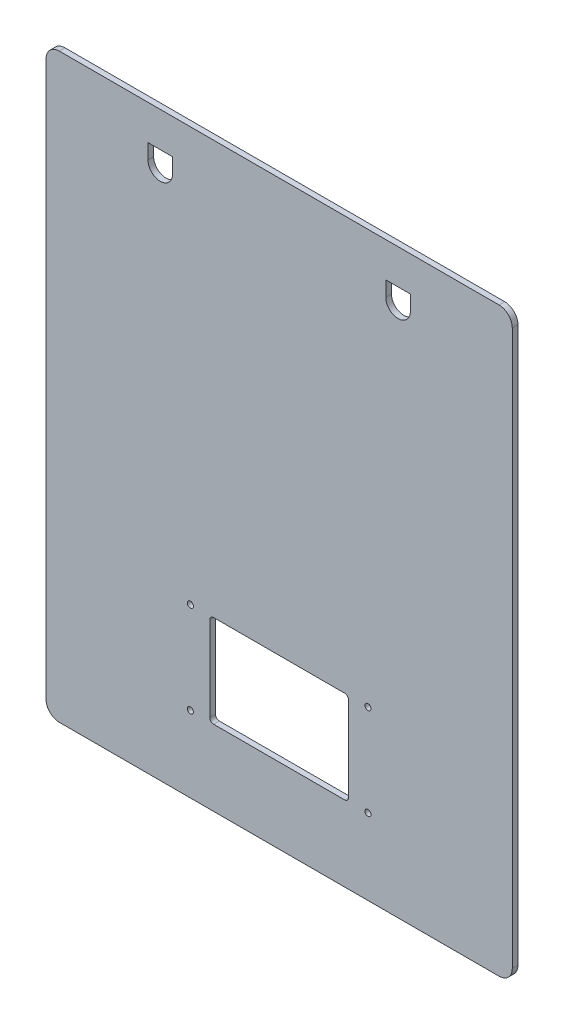
ISO-10303-21;
HEADER;
FILE_DESCRIPTION(('STEP AP214'),'2;1');
FILE_NAME('part.step','',(''),(''),'','','');
FILE_SCHEMA(('AUTOMOTIVE_DESIGN { 1 0 10303 214 1 1 1 1 }'));
ENDSEC;
DATA;
#1=APPLICATION_CONTEXT('core data for automotive mechanical design processes');
#2=APPLICATION_PROTOCOL_DEFINITION('international standard','automotive_design',2000,#1);
#3=PRODUCT_CONTEXT('',#1,'mechanical');
#4=PRODUCT('Part','Part','',(#3));
#5=PRODUCT_RELATED_PRODUCT_CATEGORY('part','',(#4));
#6=PRODUCT_DEFINITION_FORMATION('','',#4);
#7=PRODUCT_DEFINITION_CONTEXT('part definition',#1,'design');
#8=PRODUCT_DEFINITION('design','',#6,#7);
#9=PRODUCT_DEFINITION_SHAPE('','',#8);
#10=(LENGTH_UNIT() NAMED_UNIT(*) SI_UNIT(.MILLI.,.METRE.));
#11=(NAMED_UNIT(*) PLANE_ANGLE_UNIT() SI_UNIT($,.RADIAN.));
#12=(NAMED_UNIT(*) SI_UNIT($,.STERADIAN.) SOLID_ANGLE_UNIT());
#13=UNCERTAINTY_MEASURE_WITH_UNIT(LENGTH_MEASURE(1.E-05),#10,'distance_accuracy_value','');
#14=(GEOMETRIC_REPRESENTATION_CONTEXT(3) GLOBAL_UNCERTAINTY_ASSIGNED_CONTEXT((#13)) GLOBAL_UNIT_ASSIGNED_CONTEXT((#10,
#11,#12)) REPRESENTATION_CONTEXT('',''));
#15=CARTESIAN_POINT('',(0.,0.,0.));
#16=DIRECTION('',(0.,0.,1.));
#17=DIRECTION('',(1.,0.,0.));
#18=AXIS2_PLACEMENT_3D('',#15,#16,#17);
#19=CARTESIAN_POINT('',(7.,7.,3.));
#20=DIRECTION('',(0.,0.,-1.));
#21=DIRECTION('',(-1.,0.,0.));
#22=AXIS2_PLACEMENT_3D('',#19,#20,#21);
#23=CYLINDRICAL_SURFACE('',#22,7.);
#24=CARTESIAN_POINT('',(7.,7.,0.));
#25=DIRECTION('',(0.,0.,1.));
#26=DIRECTION('',(1.,0.,0.));
#27=AXIS2_PLACEMENT_3D('',#24,#25,#26);
#28=CIRCLE('',#27,7.);
#29=CARTESIAN_POINT('',(0.,7.00000000000005,0.));
#30=VERTEX_POINT('',#29);
#31=CARTESIAN_POINT('',(7.00000000000005,0.,0.));
#32=VERTEX_POINT('',#31);
#33=EDGE_CURVE('E323',#30,#32,#28,.T.);
#34=ORIENTED_EDGE('',*,*,#33,.T.);
#35=DIRECTION('',(0.,0.,-1.));
#36=VECTOR('',#35,1.);
#37=CARTESIAN_POINT('',(7.00000000000005,0.,3.));
#38=LINE('',#37,#36);
#39=CARTESIAN_POINT('',(7.00000000000005,0.,3.));
#40=VERTEX_POINT('',#39);
#41=EDGE_CURVE('E11',#40,#32,#38,.T.);
#42=ORIENTED_EDGE('',*,*,#41,.F.);
#43=CARTESIAN_POINT('',(7.,7.,3.));
#44=DIRECTION('',(0.,0.,1.));
#45=DIRECTION('',(1.,0.,0.));
#46=AXIS2_PLACEMENT_3D('',#43,#44,#45);
#47=CIRCLE('',#46,7.);
#48=CARTESIAN_POINT('',(0.,7.00000000000005,3.));
#49=VERTEX_POINT('',#48);
#50=EDGE_CURVE('E330',#49,#40,#47,.T.);
#51=ORIENTED_EDGE('',*,*,#50,.F.);
#52=DIRECTION('',(0.,0.,-1.));
#53=VECTOR('',#52,1.);
#54=CARTESIAN_POINT('',(0.,7.00000000000005,3.));
#55=LINE('',#54,#53);
#56=EDGE_CURVE('E348',#49,#30,#55,.T.);
#57=ORIENTED_EDGE('',*,*,#56,.T.);
#58=EDGE_LOOP('',(#34,#42,#51,#57));
#59=FACE_BOUND('',#58,.T.);
#60=ADVANCED_FACE('F33',(#59),#23,.T.);
#61=CARTESIAN_POINT('',(7.00000000000005,0.,3.));
#62=DIRECTION('',(0.,1.,0.));
#63=DIRECTION('',(0.,0.,1.));
#64=AXIS2_PLACEMENT_3D('',#61,#62,#63);
#65=PLANE('',#64);
#66=DIRECTION('',(1.,0.,0.));
#67=VECTOR('',#66,1.);
#68=CARTESIAN_POINT('',(7.00000000000005,0.,0.));
#69=LINE('',#68,#67);
#70=CARTESIAN_POINT('',(240.,0.,0.));
#71=VERTEX_POINT('',#70);
#72=EDGE_CURVE('E351',#32,#71,#69,.T.);
#73=ORIENTED_EDGE('',*,*,#72,.T.);
#74=DIRECTION('',(0.,0.,-1.));
#75=VECTOR('',#74,1.);
#76=CARTESIAN_POINT('',(240.,0.,3.));
#77=LINE('',#76,#75);
#78=CARTESIAN_POINT('',(240.,0.,3.));
#79=VERTEX_POINT('',#78);
#80=EDGE_CURVE('E40',#79,#71,#77,.T.);
#81=ORIENTED_EDGE('',*,*,#80,.F.);
#82=DIRECTION('',(1.,0.,0.));
#83=VECTOR('',#82,1.);
#84=CARTESIAN_POINT('',(7.00000000000005,0.,3.));
#85=LINE('',#84,#83);
#86=EDGE_CURVE('E333',#40,#79,#85,.T.);
#87=ORIENTED_EDGE('',*,*,#86,.F.);
#88=ORIENTED_EDGE('',*,*,#41,.T.);
#89=EDGE_LOOP('',(#73,#81,#87,#88));
#90=FACE_BOUND('',#89,.T.);
#91=ADVANCED_FACE('F407',(#90),#65,.F.);
#92=CARTESIAN_POINT('',(240.,7.,3.));
#93=DIRECTION('',(0.,0.,-1.));
#94=DIRECTION('',(-1.,0.,0.));
#95=AXIS2_PLACEMENT_3D('',#92,#93,#94);
#96=CYLINDRICAL_SURFACE('',#95,7.);
#97=CARTESIAN_POINT('',(240.,7.,0.));
#98=DIRECTION('',(0.,0.,1.));
#99=DIRECTION('',(1.,0.,0.));
#100=AXIS2_PLACEMENT_3D('',#97,#98,#99);
#101=CIRCLE('',#100,7.);
#102=CARTESIAN_POINT('',(247.,7.00000000000005,0.));
#103=VERTEX_POINT('',#102);
#104=EDGE_CURVE('E353',#71,#103,#101,.T.);
#105=ORIENTED_EDGE('',*,*,#104,.T.);
#106=DIRECTION('',(0.,0.,-1.));
#107=VECTOR('',#106,1.);
#108=CARTESIAN_POINT('',(247.,7.00000000000005,3.));
#109=LINE('',#108,#107);
#110=CARTESIAN_POINT('',(247.,7.00000000000005,3.));
#111=VERTEX_POINT('',#110);
#112=EDGE_CURVE('E378',#111,#103,#109,.T.);
#113=ORIENTED_EDGE('',*,*,#112,.F.);
#114=CARTESIAN_POINT('',(240.,7.,3.));
#115=DIRECTION('',(0.,0.,1.));
#116=DIRECTION('',(1.,0.,0.));
#117=AXIS2_PLACEMENT_3D('',#114,#115,#116);
#118=CIRCLE('',#117,7.);
#119=EDGE_CURVE('E336',#79,#111,#118,.T.);
#120=ORIENTED_EDGE('',*,*,#119,.F.);
#121=ORIENTED_EDGE('',*,*,#80,.T.);
#122=EDGE_LOOP('',(#105,#113,#120,#121));
#123=FACE_BOUND('',#122,.T.);
#124=ADVANCED_FACE('F385',(#123),#96,.T.);
#125=CARTESIAN_POINT('',(247.,7.00000000000005,3.));
#126=DIRECTION('',(-1.,0.,0.));
#127=DIRECTION('',(0.,0.,1.));
#128=AXIS2_PLACEMENT_3D('',#125,#126,#127);
#129=PLANE('',#128);
#130=DIRECTION('',(0.,1.,0.));
#131=VECTOR('',#130,1.);
#132=CARTESIAN_POINT('',(247.,7.00000000000005,0.));
#133=LINE('',#132,#131);
#134=CARTESIAN_POINT('',(247.,301.,0.));
#135=VERTEX_POINT('',#134);
#136=EDGE_CURVE('E355',#103,#135,#133,.T.);
#137=ORIENTED_EDGE('',*,*,#136,.T.);
#138=DIRECTION('',(0.,0.,-1.));
#139=VECTOR('',#138,1.);
#140=CARTESIAN_POINT('',(247.,301.,3.));
#141=LINE('',#140,#139);
#142=CARTESIAN_POINT('',(247.,301.,3.));
#143=VERTEX_POINT('',#142);
#144=EDGE_CURVE('E375',#143,#135,#141,.T.);
#145=ORIENTED_EDGE('',*,*,#144,.F.);
#146=DIRECTION('',(0.,1.,0.));
#147=VECTOR('',#146,1.);
#148=CARTESIAN_POINT('',(247.,7.00000000000005,3.));
#149=LINE('',#148,#147);
#150=EDGE_CURVE('E338',#111,#143,#149,.T.);
#151=ORIENTED_EDGE('',*,*,#150,.F.);
#152=ORIENTED_EDGE('',*,*,#112,.T.);
#153=EDGE_LOOP('',(#137,#145,#151,#152));
#154=FACE_BOUND('',#153,.T.);
#155=ADVANCED_FACE('F396',(#154),#129,.F.);
#156=CARTESIAN_POINT('',(240.,301.,3.));
#157=DIRECTION('',(0.,0.,-1.));
#158=DIRECTION('',(-1.,0.,0.));
#159=AXIS2_PLACEMENT_3D('',#156,#157,#158);
#160=CYLINDRICAL_SURFACE('',#159,7.00000000000001);
#161=CARTESIAN_POINT('',(240.,301.,0.));
#162=DIRECTION('',(0.,0.,1.));
#163=DIRECTION('',(1.,0.,0.));
#164=AXIS2_PLACEMENT_3D('',#161,#162,#163);
#165=CIRCLE('',#164,7.00000000000001);
#166=CARTESIAN_POINT('',(240.,308.,0.));
#167=VERTEX_POINT('',#166);
#168=EDGE_CURVE('E357',#135,#167,#165,.T.);
#169=ORIENTED_EDGE('',*,*,#168,.T.);
#170=DIRECTION('',(0.,0.,-1.));
#171=VECTOR('',#170,1.);
#172=CARTESIAN_POINT('',(240.,308.,3.));
#173=LINE('',#172,#171);
#174=CARTESIAN_POINT('',(240.,308.,3.));
#175=VERTEX_POINT('',#174);
#176=EDGE_CURVE('E372',#175,#167,#173,.T.);
#177=ORIENTED_EDGE('',*,*,#176,.F.);
#178=CARTESIAN_POINT('',(240.,301.,3.));
#179=DIRECTION('',(0.,0.,1.));
#180=DIRECTION('',(1.,0.,0.));
#181=AXIS2_PLACEMENT_3D('',#178,#179,#180);
#182=CIRCLE('',#181,7.00000000000001);
#183=EDGE_CURVE('E340',#143,#175,#182,.T.);
#184=ORIENTED_EDGE('',*,*,#183,.F.);
#185=ORIENTED_EDGE('',*,*,#144,.T.);
#186=EDGE_LOOP('',(#169,#177,#184,#185));
#187=FACE_BOUND('',#186,.T.);
#188=ADVANCED_FACE('F400',(#187),#160,.T.);
#189=CARTESIAN_POINT('',(7.00000000000005,308.,3.));
#190=DIRECTION('',(0.,-1.,0.));
#191=DIRECTION('',(0.,0.,-1.));
#192=AXIS2_PLACEMENT_3D('',#189,#190,#191);
#193=PLANE('',#192);
#194=DIRECTION('',(-1.,0.,0.));
#195=VECTOR('',#194,1.);
#196=CARTESIAN_POINT('',(7.00000000000005,308.,0.));
#197=LINE('',#196,#195);
#198=CARTESIAN_POINT('',(7.00000000000005,308.,0.));
#199=VERTEX_POINT('',#198);
#200=EDGE_CURVE('E359',#167,#199,#197,.T.);
#201=ORIENTED_EDGE('',*,*,#200,.T.);
#202=DIRECTION('',(0.,0.,-1.));
#203=VECTOR('',#202,1.);
#204=CARTESIAN_POINT('',(7.00000000000005,308.,3.));
#205=LINE('',#204,#203);
#206=CARTESIAN_POINT('',(7.00000000000005,308.,3.));
#207=VERTEX_POINT('',#206);
#208=EDGE_CURVE('E369',#207,#199,#205,.T.);
#209=ORIENTED_EDGE('',*,*,#208,.F.);
#210=DIRECTION('',(-1.,0.,0.));
#211=VECTOR('',#210,1.);
#212=CARTESIAN_POINT('',(7.00000000000005,308.,3.));
#213=LINE('',#212,#211);
#214=EDGE_CURVE('E342',#175,#207,#213,.T.);
#215=ORIENTED_EDGE('',*,*,#214,.F.);
#216=ORIENTED_EDGE('',*,*,#176,.T.);
#217=EDGE_LOOP('',(#201,#209,#215,#216));
#218=FACE_BOUND('',#217,.T.);
#219=ADVANCED_FACE('F420',(#218),#193,.F.);
#220=CARTESIAN_POINT('',(7.,301.,3.));
#221=DIRECTION('',(0.,0.,-1.));
#222=DIRECTION('',(-1.,0.,0.));
#223=AXIS2_PLACEMENT_3D('',#220,#221,#222);
#224=CYLINDRICAL_SURFACE('',#223,7.);
#225=CARTESIAN_POINT('',(7.,301.,0.));
#226=DIRECTION('',(0.,0.,1.));
#227=DIRECTION('',(-1.,0.,0.));
#228=AXIS2_PLACEMENT_3D('',#225,#226,#227);
#229=CIRCLE('',#228,7.);
#230=CARTESIAN_POINT('',(0.,301.,0.));
#231=VERTEX_POINT('',#230);
#232=EDGE_CURVE('E361',#199,#231,#229,.T.);
#233=ORIENTED_EDGE('',*,*,#232,.T.);
#234=DIRECTION('',(0.,0.,-1.));
#235=VECTOR('',#234,1.);
#236=CARTESIAN_POINT('',(0.,301.,3.));
#237=LINE('',#236,#235);
#238=CARTESIAN_POINT('',(0.,301.,3.));
#239=VERTEX_POINT('',#238);
#240=EDGE_CURVE('E366',#239,#231,#237,.T.);
#241=ORIENTED_EDGE('',*,*,#240,.F.);
#242=CARTESIAN_POINT('',(7.,301.,3.));
#243=DIRECTION('',(0.,0.,1.));
#244=DIRECTION('',(-1.,0.,0.));
#245=AXIS2_PLACEMENT_3D('',#242,#243,#244);
#246=CIRCLE('',#245,7.);
#247=EDGE_CURVE('E344',#207,#239,#246,.T.);
#248=ORIENTED_EDGE('',*,*,#247,.F.);
#249=ORIENTED_EDGE('',*,*,#208,.T.);
#250=EDGE_LOOP('',(#233,#241,#248,#249));
#251=FACE_BOUND('',#250,.T.);
#252=ADVANCED_FACE('F418',(#251),#224,.T.);
#253=CARTESIAN_POINT('',(0.,7.00000000000005,3.));
#254=DIRECTION('',(1.,0.,0.));
#255=DIRECTION('',(0.,0.,-1.));
#256=AXIS2_PLACEMENT_3D('',#253,#254,#255);
#257=PLANE('',#256);
#258=DIRECTION('',(0.,-1.,0.));
#259=VECTOR('',#258,1.);
#260=CARTESIAN_POINT('',(0.,7.00000000000005,0.));
#261=LINE('',#260,#259);
#262=EDGE_CURVE('E334',#231,#30,#261,.T.);
#263=ORIENTED_EDGE('',*,*,#262,.T.);
#264=ORIENTED_EDGE('',*,*,#56,.F.);
#265=DIRECTION('',(0.,-1.,0.));
#266=VECTOR('',#265,1.);
#267=CARTESIAN_POINT('',(0.,7.00000000000005,3.));
#268=LINE('',#267,#266);
#269=EDGE_CURVE('E346',#239,#49,#268,.T.);
#270=ORIENTED_EDGE('',*,*,#269,.F.);
#271=ORIENTED_EDGE('',*,*,#240,.T.);
#272=EDGE_LOOP('',(#263,#264,#270,#271));
#273=FACE_BOUND('',#272,.T.);
#274=ADVANCED_FACE('F413',(#273),#257,.F.);
#275=CARTESIAN_POINT('',(7.,7.,3.));
#276=DIRECTION('',(0.,0.,1.));
#277=DIRECTION('',(1.,0.,0.));
#278=AXIS2_PLACEMENT_3D('',#275,#276,#277);
#279=PLANE('',#278);
#280=CARTESIAN_POINT('',(76.45,88.75,3.));
#281=DIRECTION('',(0.,0.,-1.));
#282=DIRECTION('',(1.,0.,0.));
#283=AXIS2_PLACEMENT_3D('',#280,#281,#282);
#284=CIRCLE('',#283,1.60000000000002);
#285=CARTESIAN_POINT('',(78.05,88.75,3.));
#286=VERTEX_POINT('',#285);
#287=EDGE_CURVE('E683',#286,#286,#284,.T.);
#288=ORIENTED_EDGE('',*,*,#287,.T.);
#289=EDGE_LOOP('',(#288));
#290=FACE_BOUND('',#289,.T.);
#291=CARTESIAN_POINT('',(170.55,40.21,3.));
#292=DIRECTION('',(0.,0.,-1.));
#293=DIRECTION('',(-1.,0.,0.));
#294=AXIS2_PLACEMENT_3D('',#291,#292,#293);
#295=CIRCLE('',#294,1.60000000000002);
#296=CARTESIAN_POINT('',(168.95,40.21,3.));
#297=VERTEX_POINT('',#296);
#298=EDGE_CURVE('E701',#297,#297,#295,.T.);
#299=ORIENTED_EDGE('',*,*,#298,.T.);
#300=EDGE_LOOP('',(#299));
#301=FACE_BOUND('',#300,.T.);
#302=CARTESIAN_POINT('',(76.45,40.21,3.));
#303=DIRECTION('',(0.,0.,-1.));
#304=DIRECTION('',(1.,0.,0.));
#305=AXIS2_PLACEMENT_3D('',#302,#303,#304);
#306=CIRCLE('',#305,1.60000000000002);
#307=CARTESIAN_POINT('',(78.05,40.21,3.));
#308=VERTEX_POINT('',#307);
#309=EDGE_CURVE('E696',#308,#308,#306,.T.);
#310=ORIENTED_EDGE('',*,*,#309,.T.);
#311=EDGE_LOOP('',(#310));
#312=FACE_BOUND('',#311,.T.);
#313=CARTESIAN_POINT('',(170.55,88.75,3.));
#314=DIRECTION('',(0.,0.,-1.));
#315=DIRECTION('',(-1.,0.,0.));
#316=AXIS2_PLACEMENT_3D('',#313,#314,#315);
#317=CIRCLE('',#316,1.60000000000002);
#318=CARTESIAN_POINT('',(168.95,88.75,3.));
#319=VERTEX_POINT('',#318);
#320=EDGE_CURVE('E236',#319,#319,#317,.T.);
#321=ORIENTED_EDGE('',*,*,#320,.T.);
#322=EDGE_LOOP('',(#321));
#323=FACE_BOUND('',#322,.T.);
#324=CARTESIAN_POINT('',(88.7799999999999,86.96,3.));
#325=DIRECTION('',(0.,0.,-1.));
#326=DIRECTION('',(1.,0.,0.));
#327=AXIS2_PLACEMENT_3D('',#324,#325,#326);
#328=CIRCLE('',#327,1.99999999999999);
#329=CARTESIAN_POINT('',(86.78,86.96,3.));
#330=VERTEX_POINT('',#329);
#331=CARTESIAN_POINT('',(88.7799999999999,88.96,3.));
#332=VERTEX_POINT('',#331);
#333=EDGE_CURVE('E195',#330,#332,#328,.T.);
#334=ORIENTED_EDGE('',*,*,#333,.T.);
#335=DIRECTION('',(1.,0.,0.));
#336=VECTOR('',#335,1.);
#337=CARTESIAN_POINT('',(158.22,88.96,3.));
#338=LINE('',#337,#336);
#339=CARTESIAN_POINT('',(158.22,88.96,3.));
#340=VERTEX_POINT('',#339);
#341=EDGE_CURVE('E204',#332,#340,#338,.T.);
#342=ORIENTED_EDGE('',*,*,#341,.T.);
#343=CARTESIAN_POINT('',(158.22,86.96,3.));
#344=DIRECTION('',(0.,0.,-1.));
#345=DIRECTION('',(-1.,0.,0.));
#346=AXIS2_PLACEMENT_3D('',#343,#344,#345);
#347=CIRCLE('',#346,2.);
#348=CARTESIAN_POINT('',(160.22,86.96,3.));
#349=VERTEX_POINT('',#348);
#350=EDGE_CURVE('E47',#340,#349,#347,.T.);
#351=ORIENTED_EDGE('',*,*,#350,.T.);
#352=DIRECTION('',(0.,-1.,0.));
#353=VECTOR('',#352,1.);
#354=CARTESIAN_POINT('',(160.22,86.96,3.));
#355=LINE('',#354,#353);
#356=CARTESIAN_POINT('',(160.22,42.,3.));
#357=VERTEX_POINT('',#356);
#358=EDGE_CURVE('E222',#349,#357,#355,.T.);
#359=ORIENTED_EDGE('',*,*,#358,.T.);
#360=CARTESIAN_POINT('',(158.22,42.,3.));
#361=DIRECTION('',(0.,0.,-1.));
#362=DIRECTION('',(1.,0.,0.));
#363=AXIS2_PLACEMENT_3D('',#360,#361,#362);
#364=CIRCLE('',#363,2.00000000000001);
#365=CARTESIAN_POINT('',(158.22,40.,3.));
#366=VERTEX_POINT('',#365);
#367=EDGE_CURVE('E225',#357,#366,#364,.T.);
#368=ORIENTED_EDGE('',*,*,#367,.T.);
#369=DIRECTION('',(-1.,0.,0.));
#370=VECTOR('',#369,1.);
#371=CARTESIAN_POINT('',(158.22,40.,3.));
#372=LINE('',#371,#370);
#373=CARTESIAN_POINT('',(88.7799999999999,40.,3.));
#374=VERTEX_POINT('',#373);
#375=EDGE_CURVE('E228',#366,#374,#372,.T.);
#376=ORIENTED_EDGE('',*,*,#375,.T.);
#377=CARTESIAN_POINT('',(88.7799999999999,42.,3.));
#378=DIRECTION('',(0.,0.,-1.));
#379=DIRECTION('',(1.,0.,0.));
#380=AXIS2_PLACEMENT_3D('',#377,#378,#379);
#381=CIRCLE('',#380,1.99999999999999);
#382=CARTESIAN_POINT('',(86.78,42.,3.));
#383=VERTEX_POINT('',#382);
#384=EDGE_CURVE('E231',#374,#383,#381,.T.);
#385=ORIENTED_EDGE('',*,*,#384,.T.);
#386=DIRECTION('',(0.,1.,0.));
#387=VECTOR('',#386,1.);
#388=CARTESIAN_POINT('',(86.78,86.96,3.));
#389=LINE('',#388,#387);
#390=EDGE_CURVE('E201',#383,#330,#389,.T.);
#391=ORIENTED_EDGE('',*,*,#390,.T.);
#392=EDGE_LOOP('',(#334,#342,#351,#359,#368,#376,#385,#391));
#393=FACE_BOUND('',#392,.T.);
#394=CARTESIAN_POINT('',(186.5,281.5,3.));
#395=DIRECTION('',(0.,0.,-1.));
#396=DIRECTION('',(-1.,0.,0.));
#397=AXIS2_PLACEMENT_3D('',#394,#395,#396);
#398=CIRCLE('',#397,6.50000000000001);
#399=CARTESIAN_POINT('',(193.,281.5,3.));
#400=VERTEX_POINT('',#399);
#401=CARTESIAN_POINT('',(180.,281.5,3.));
#402=VERTEX_POINT('',#401);
#403=EDGE_CURVE('E266',#400,#402,#398,.T.);
#404=ORIENTED_EDGE('',*,*,#403,.T.);
#405=DIRECTION('',(0.,1.,0.));
#406=VECTOR('',#405,1.);
#407=CARTESIAN_POINT('',(180.,289.5,3.));
#408=LINE('',#407,#406);
#409=CARTESIAN_POINT('',(180.,289.526253407612,3.));
#410=VERTEX_POINT('',#409);
#411=EDGE_CURVE('E269',#402,#410,#408,.T.);
#412=ORIENTED_EDGE('',*,*,#411,.T.);
#413=DIRECTION('',(1.,0.,0.));
#414=VECTOR('',#413,1.);
#415=CARTESIAN_POINT('',(193.,289.526253407612,3.));
#416=LINE('',#415,#414);
#417=CARTESIAN_POINT('',(193.,289.526253407612,3.));
#418=VERTEX_POINT('',#417);
#419=EDGE_CURVE('E273',#410,#418,#416,.T.);
#420=ORIENTED_EDGE('',*,*,#419,.T.);
#421=DIRECTION('',(2.11443604012251E-11,-1.,0.));
#422=VECTOR('',#421,1.);
#423=CARTESIAN_POINT('',(193.,289.5,3.));
#424=LINE('',#423,#422);
#425=EDGE_CURVE('E276',#418,#400,#424,.T.);
#426=ORIENTED_EDGE('',*,*,#425,.T.);
#427=EDGE_LOOP('',(#404,#412,#420,#426));
#428=FACE_BOUND('',#427,.T.);
#429=DIRECTION('',(0.,1.,0.));
#430=VECTOR('',#429,1.);
#431=CARTESIAN_POINT('',(54.0000000000004,289.5,3.));
#432=LINE('',#431,#430);
#433=CARTESIAN_POINT('',(54.0000000000004,281.5,3.));
#434=VERTEX_POINT('',#433);
#435=CARTESIAN_POINT('',(54.0000000000004,289.5,3.));
#436=VERTEX_POINT('',#435);
#437=EDGE_CURVE('E298',#434,#436,#432,.T.);
#438=ORIENTED_EDGE('',*,*,#437,.T.);
#439=DIRECTION('',(1.,0.,0.));
#440=VECTOR('',#439,1.);
#441=CARTESIAN_POINT('',(54.0000000000004,289.5,3.));
#442=LINE('',#441,#440);
#443=CARTESIAN_POINT('',(67.0000000000004,289.5,3.));
#444=VERTEX_POINT('',#443);
#445=EDGE_CURVE('E301',#436,#444,#442,.T.);
#446=ORIENTED_EDGE('',*,*,#445,.T.);
#447=DIRECTION('',(0.,-1.,0.));
#448=VECTOR('',#447,1.);
#449=CARTESIAN_POINT('',(67.0000000000004,289.5,3.));
#450=LINE('',#449,#448);
#451=CARTESIAN_POINT('',(67.0000000000004,281.5,3.));
#452=VERTEX_POINT('',#451);
#453=EDGE_CURVE('E305',#444,#452,#450,.T.);
#454=ORIENTED_EDGE('',*,*,#453,.T.);
#455=CARTESIAN_POINT('',(60.5000000000004,281.5,3.));
#456=DIRECTION('',(0.,0.,-1.));
#457=DIRECTION('',(1.,0.,0.));
#458=AXIS2_PLACEMENT_3D('',#455,#456,#457);
#459=CIRCLE('',#458,6.5);
#460=EDGE_CURVE('E308',#452,#434,#459,.T.);
#461=ORIENTED_EDGE('',*,*,#460,.T.);
#462=EDGE_LOOP('',(#438,#446,#454,#461));
#463=FACE_BOUND('',#462,.T.);
#464=ORIENTED_EDGE('',*,*,#50,.T.);
#465=ORIENTED_EDGE('',*,*,#86,.T.);
#466=ORIENTED_EDGE('',*,*,#119,.T.);
#467=ORIENTED_EDGE('',*,*,#150,.T.);
#468=ORIENTED_EDGE('',*,*,#183,.T.);
#469=ORIENTED_EDGE('',*,*,#214,.T.);
#470=ORIENTED_EDGE('',*,*,#247,.T.);
#471=ORIENTED_EDGE('',*,*,#269,.T.);
#472=EDGE_LOOP('',(#464,#465,#466,#467,#468,#469,#470,#471));
#473=FACE_BOUND('',#472,.T.);
#474=ADVANCED_FACE('F208',(#290,#301,#312,#323,#393,#428,#463,#473),#279,.T.);
#475=CARTESIAN_POINT('',(7.,7.,0.));
#476=DIRECTION('',(0.,0.,1.));
#477=DIRECTION('',(1.,0.,0.));
#478=AXIS2_PLACEMENT_3D('',#475,#476,#477);
#479=PLANE('',#478);
#480=CARTESIAN_POINT('',(76.45,88.75,0.));
#481=DIRECTION('',(0.,0.,-1.));
#482=DIRECTION('',(1.,0.,0.));
#483=AXIS2_PLACEMENT_3D('',#480,#481,#482);
#484=CIRCLE('',#483,1.60000000000002);
#485=CARTESIAN_POINT('',(78.05,88.75,0.));
#486=VERTEX_POINT('',#485);
#487=EDGE_CURVE('E686',#486,#486,#484,.T.);
#488=ORIENTED_EDGE('',*,*,#487,.F.);
#489=EDGE_LOOP('',(#488));
#490=FACE_BOUND('',#489,.T.);
#491=CARTESIAN_POINT('',(170.55,40.21,0.));
#492=DIRECTION('',(0.,0.,-1.));
#493=DIRECTION('',(-1.,0.,0.));
#494=AXIS2_PLACEMENT_3D('',#491,#492,#493);
#495=CIRCLE('',#494,1.60000000000002);
#496=CARTESIAN_POINT('',(168.95,40.21,0.));
#497=VERTEX_POINT('',#496);
#498=EDGE_CURVE('E688',#497,#497,#495,.T.);
#499=ORIENTED_EDGE('',*,*,#498,.F.);
#500=EDGE_LOOP('',(#499));
#501=FACE_BOUND('',#500,.T.);
#502=CARTESIAN_POINT('',(76.45,40.21,0.));
#503=DIRECTION('',(0.,0.,-1.));
#504=DIRECTION('',(1.,0.,0.));
#505=AXIS2_PLACEMENT_3D('',#502,#503,#504);
#506=CIRCLE('',#505,1.60000000000002);
#507=CARTESIAN_POINT('',(78.05,40.21,0.));
#508=VERTEX_POINT('',#507);
#509=EDGE_CURVE('E218',#508,#508,#506,.T.);
#510=ORIENTED_EDGE('',*,*,#509,.F.);
#511=EDGE_LOOP('',(#510));
#512=FACE_BOUND('',#511,.T.);
#513=CARTESIAN_POINT('',(170.55,88.75,0.));
#514=DIRECTION('',(0.,0.,-1.));
#515=DIRECTION('',(-1.,0.,0.));
#516=AXIS2_PLACEMENT_3D('',#513,#514,#515);
#517=CIRCLE('',#516,1.60000000000002);
#518=CARTESIAN_POINT('',(168.95,88.75,0.));
#519=VERTEX_POINT('',#518);
#520=EDGE_CURVE('E694',#519,#519,#517,.T.);
#521=ORIENTED_EDGE('',*,*,#520,.F.);
#522=EDGE_LOOP('',(#521));
#523=FACE_BOUND('',#522,.T.);
#524=DIRECTION('',(1.,0.,0.));
#525=VECTOR('',#524,1.);
#526=CARTESIAN_POINT('',(158.22,88.96,0.));
#527=LINE('',#526,#525);
#528=CARTESIAN_POINT('',(88.7799999999999,88.96,0.));
#529=VERTEX_POINT('',#528);
#530=CARTESIAN_POINT('',(158.22,88.96,0.));
#531=VERTEX_POINT('',#530);
#532=EDGE_CURVE('E235',#529,#531,#527,.T.);
#533=ORIENTED_EDGE('',*,*,#532,.F.);
#534=CARTESIAN_POINT('',(88.7799999999999,86.96,0.));
#535=DIRECTION('',(0.,0.,-1.));
#536=DIRECTION('',(1.,0.,0.));
#537=AXIS2_PLACEMENT_3D('',#534,#535,#536);
#538=CIRCLE('',#537,1.99999999999999);
#539=CARTESIAN_POINT('',(86.78,86.96,0.));
#540=VERTEX_POINT('',#539);
#541=EDGE_CURVE('E55',#540,#529,#538,.T.);
#542=ORIENTED_EDGE('',*,*,#541,.F.);
#543=DIRECTION('',(0.,1.,0.));
#544=VECTOR('',#543,1.);
#545=CARTESIAN_POINT('',(86.78,86.96,0.));
#546=LINE('',#545,#544);
#547=CARTESIAN_POINT('',(86.78,42.,0.));
#548=VERTEX_POINT('',#547);
#549=EDGE_CURVE('E212',#548,#540,#546,.T.);
#550=ORIENTED_EDGE('',*,*,#549,.F.);
#551=CARTESIAN_POINT('',(88.7799999999999,42.,0.));
#552=DIRECTION('',(0.,0.,-1.));
#553=DIRECTION('',(1.,0.,0.));
#554=AXIS2_PLACEMENT_3D('',#551,#552,#553);
#555=CIRCLE('',#554,1.99999999999999);
#556=CARTESIAN_POINT('',(88.7799999999999,40.,0.));
#557=VERTEX_POINT('',#556);
#558=EDGE_CURVE('E215',#557,#548,#555,.T.);
#559=ORIENTED_EDGE('',*,*,#558,.F.);
#560=DIRECTION('',(-1.,0.,0.));
#561=VECTOR('',#560,1.);
#562=CARTESIAN_POINT('',(158.22,40.,0.));
#563=LINE('',#562,#561);
#564=CARTESIAN_POINT('',(158.22,40.,0.));
#565=VERTEX_POINT('',#564);
#566=EDGE_CURVE('E247',#565,#557,#563,.T.);
#567=ORIENTED_EDGE('',*,*,#566,.F.);
#568=CARTESIAN_POINT('',(158.22,42.,0.));
#569=DIRECTION('',(0.,0.,-1.));
#570=DIRECTION('',(1.,0.,0.));
#571=AXIS2_PLACEMENT_3D('',#568,#569,#570);
#572=CIRCLE('',#571,2.00000000000001);
#573=CARTESIAN_POINT('',(160.22,42.,0.));
#574=VERTEX_POINT('',#573);
#575=EDGE_CURVE('E244',#574,#565,#572,.T.);
#576=ORIENTED_EDGE('',*,*,#575,.F.);
#577=DIRECTION('',(0.,-1.,0.));
#578=VECTOR('',#577,1.);
#579=CARTESIAN_POINT('',(160.22,86.96,0.));
#580=LINE('',#579,#578);
#581=CARTESIAN_POINT('',(160.22,86.96,0.));
#582=VERTEX_POINT('',#581);
#583=EDGE_CURVE('E241',#582,#574,#580,.T.);
#584=ORIENTED_EDGE('',*,*,#583,.F.);
#585=CARTESIAN_POINT('',(158.22,86.96,0.));
#586=DIRECTION('',(0.,0.,-1.));
#587=DIRECTION('',(-1.,0.,0.));
#588=AXIS2_PLACEMENT_3D('',#585,#586,#587);
#589=CIRCLE('',#588,2.);
#590=EDGE_CURVE('E238',#531,#582,#589,.T.);
#591=ORIENTED_EDGE('',*,*,#590,.F.);
#592=EDGE_LOOP('',(#533,#542,#550,#559,#567,#576,#584,#591));
#593=FACE_BOUND('',#592,.T.);
#594=DIRECTION('',(-2.11443604012251E-11,1.,0.));
#595=VECTOR('',#594,1.);
#596=CARTESIAN_POINT('',(180.,289.526253407612,0.));
#597=LINE('',#596,#595);
#598=CARTESIAN_POINT('',(180.000000000169,281.5,0.));
#599=VERTEX_POINT('',#598);
#600=CARTESIAN_POINT('',(180.,289.526253407612,0.));
#601=VERTEX_POINT('',#600);
#602=EDGE_CURVE('E281',#599,#601,#597,.T.);
#603=ORIENTED_EDGE('',*,*,#602,.F.);
#604=CARTESIAN_POINT('',(186.5,281.5,0.));
#605=DIRECTION('',(0.,0.,-1.));
#606=DIRECTION('',(-1.,0.,0.));
#607=AXIS2_PLACEMENT_3D('',#604,#605,#606);
#608=CIRCLE('',#607,6.50000000000001);
#609=CARTESIAN_POINT('',(193.,281.5,0.));
#610=VERTEX_POINT('',#609);
#611=EDGE_CURVE('E254',#610,#599,#608,.T.);
#612=ORIENTED_EDGE('',*,*,#611,.F.);
#613=DIRECTION('',(0.,-1.,0.));
#614=VECTOR('',#613,1.);
#615=CARTESIAN_POINT('',(193.,289.5,0.));
#616=LINE('',#615,#614);
#617=CARTESIAN_POINT('',(193.,289.526253407612,0.));
#618=VERTEX_POINT('',#617);
#619=EDGE_CURVE('E270',#618,#610,#616,.T.);
#620=ORIENTED_EDGE('',*,*,#619,.F.);
#621=DIRECTION('',(1.,0.,0.));
#622=VECTOR('',#621,1.);
#623=CARTESIAN_POINT('',(193.,289.526253407612,0.));
#624=LINE('',#623,#622);
#625=EDGE_CURVE('E284',#601,#618,#624,.T.);
#626=ORIENTED_EDGE('',*,*,#625,.F.);
#627=EDGE_LOOP('',(#603,#612,#620,#626));
#628=FACE_BOUND('',#627,.T.);
#629=DIRECTION('',(1.,0.,0.));
#630=VECTOR('',#629,1.);
#631=CARTESIAN_POINT('',(54.0000000000004,289.5,0.));
#632=LINE('',#631,#630);
#633=CARTESIAN_POINT('',(54.0000000000004,289.5,0.));
#634=VERTEX_POINT('',#633);
#635=CARTESIAN_POINT('',(67.0000000000004,289.5,0.));
#636=VERTEX_POINT('',#635);
#637=EDGE_CURVE('E313',#634,#636,#632,.T.);
#638=ORIENTED_EDGE('',*,*,#637,.F.);
#639=DIRECTION('',(0.,1.,0.));
#640=VECTOR('',#639,1.);
#641=CARTESIAN_POINT('',(54.0000000000004,289.5,0.));
#642=LINE('',#641,#640);
#643=CARTESIAN_POINT('',(54.0000000000004,281.5,0.));
#644=VERTEX_POINT('',#643);
#645=EDGE_CURVE('E291',#644,#634,#642,.T.);
#646=ORIENTED_EDGE('',*,*,#645,.F.);
#647=CARTESIAN_POINT('',(60.5000000000004,281.5,0.));
#648=DIRECTION('',(0.,0.,-1.));
#649=DIRECTION('',(1.,0.,0.));
#650=AXIS2_PLACEMENT_3D('',#647,#648,#649);
#651=CIRCLE('',#650,6.5);
#652=CARTESIAN_POINT('',(67.0000000000004,281.5,0.));
#653=VERTEX_POINT('',#652);
#654=EDGE_CURVE('E302',#653,#644,#651,.T.);
#655=ORIENTED_EDGE('',*,*,#654,.F.);
#656=DIRECTION('',(0.,-1.,0.));
#657=VECTOR('',#656,1.);
#658=CARTESIAN_POINT('',(67.0000000000004,289.5,0.));
#659=LINE('',#658,#657);
#660=EDGE_CURVE('E316',#636,#653,#659,.T.);
#661=ORIENTED_EDGE('',*,*,#660,.F.);
#662=EDGE_LOOP('',(#638,#646,#655,#661));
#663=FACE_BOUND('',#662,.T.);
#664=ORIENTED_EDGE('',*,*,#33,.F.);
#665=ORIENTED_EDGE('',*,*,#262,.F.);
#666=ORIENTED_EDGE('',*,*,#232,.F.);
#667=ORIENTED_EDGE('',*,*,#200,.F.);
#668=ORIENTED_EDGE('',*,*,#168,.F.);
#669=ORIENTED_EDGE('',*,*,#136,.F.);
#670=ORIENTED_EDGE('',*,*,#104,.F.);
#671=ORIENTED_EDGE('',*,*,#72,.F.);
#672=EDGE_LOOP('',(#664,#665,#666,#667,#668,#669,#670,#671));
#673=FACE_BOUND('',#672,.T.);
#674=ADVANCED_FACE('F391',(#490,#501,#512,#523,#593,#628,#663,#673),#479,.F.);
#675=CARTESIAN_POINT('',(54.0000000000004,289.5,3.));
#676=DIRECTION('',(-1.,0.,0.));
#677=DIRECTION('',(0.,-1.,0.));
#678=AXIS2_PLACEMENT_3D('',#675,#676,#677);
#679=PLANE('',#678);
#680=ORIENTED_EDGE('',*,*,#645,.T.);
#681=DIRECTION('',(0.,0.,-1.));
#682=VECTOR('',#681,1.);
#683=CARTESIAN_POINT('',(54.0000000000004,289.5,3.));
#684=LINE('',#683,#682);
#685=EDGE_CURVE('E311',#436,#634,#684,.T.);
#686=ORIENTED_EDGE('',*,*,#685,.F.);
#687=ORIENTED_EDGE('',*,*,#437,.F.);
#688=DIRECTION('',(0.,0.,-1.));
#689=VECTOR('',#688,1.);
#690=CARTESIAN_POINT('',(54.0000000000004,281.5,3.));
#691=LINE('',#690,#689);
#692=EDGE_CURVE('E321',#434,#644,#691,.T.);
#693=ORIENTED_EDGE('',*,*,#692,.T.);
#694=EDGE_LOOP('',(#680,#686,#687,#693));
#695=FACE_BOUND('',#694,.T.);
#696=ADVANCED_FACE('F472',(#695),#679,.F.);
#697=CARTESIAN_POINT('',(60.5000000000004,281.5,3.));
#698=DIRECTION('',(0.,0.,-1.));
#699=DIRECTION('',(-1.,0.,0.));
#700=AXIS2_PLACEMENT_3D('',#697,#698,#699);
#701=CYLINDRICAL_SURFACE('',#700,6.5);
#702=ORIENTED_EDGE('',*,*,#654,.T.);
#703=ORIENTED_EDGE('',*,*,#692,.F.);
#704=ORIENTED_EDGE('',*,*,#460,.F.);
#705=DIRECTION('',(0.,0.,-1.));
#706=VECTOR('',#705,1.);
#707=CARTESIAN_POINT('',(67.0000000000004,281.5,3.));
#708=LINE('',#707,#706);
#709=EDGE_CURVE('E324',#452,#653,#708,.T.);
#710=ORIENTED_EDGE('',*,*,#709,.T.);
#711=EDGE_LOOP('',(#702,#703,#704,#710));
#712=FACE_BOUND('',#711,.T.);
#713=ADVANCED_FACE('F477',(#712),#701,.F.);
#714=CARTESIAN_POINT('',(67.0000000000004,289.5,3.));
#715=DIRECTION('',(1.,0.,0.));
#716=DIRECTION('',(0.,0.,-1.));
#717=AXIS2_PLACEMENT_3D('',#714,#715,#716);
#718=PLANE('',#717);
#719=ORIENTED_EDGE('',*,*,#660,.T.);
#720=ORIENTED_EDGE('',*,*,#709,.F.);
#721=ORIENTED_EDGE('',*,*,#453,.F.);
#722=DIRECTION('',(0.,0.,-1.));
#723=VECTOR('',#722,1.);
#724=CARTESIAN_POINT('',(67.0000000000004,289.5,3.));
#725=LINE('',#724,#723);
#726=EDGE_CURVE('E326',#444,#636,#725,.T.);
#727=ORIENTED_EDGE('',*,*,#726,.T.);
#728=EDGE_LOOP('',(#719,#720,#721,#727));
#729=FACE_BOUND('',#728,.T.);
#730=ADVANCED_FACE('F489',(#729),#718,.F.);
#731=CARTESIAN_POINT('',(54.0000000000004,289.5,3.));
#732=DIRECTION('',(0.,1.,0.));
#733=DIRECTION('',(0.,0.,1.));
#734=AXIS2_PLACEMENT_3D('',#731,#732,#733);
#735=PLANE('',#734);
#736=ORIENTED_EDGE('',*,*,#637,.T.);
#737=ORIENTED_EDGE('',*,*,#726,.F.);
#738=ORIENTED_EDGE('',*,*,#445,.F.);
#739=ORIENTED_EDGE('',*,*,#685,.T.);
#740=EDGE_LOOP('',(#736,#737,#738,#739));
#741=FACE_BOUND('',#740,.T.);
#742=ADVANCED_FACE('F499',(#741),#735,.F.);
#743=CARTESIAN_POINT('',(186.5,281.5,3.));
#744=DIRECTION('',(0.,0.,-1.));
#745=DIRECTION('',(-1.,0.,0.));
#746=AXIS2_PLACEMENT_3D('',#743,#744,#745);
#747=CYLINDRICAL_SURFACE('',#746,6.50000000000001);
#748=ORIENTED_EDGE('',*,*,#611,.T.);
#749=DIRECTION('',(0.,0.,-1.));
#750=VECTOR('',#749,1.);
#751=CARTESIAN_POINT('',(180.,281.5,3.));
#752=LINE('',#751,#750);
#753=EDGE_CURVE('E279',#402,#599,#752,.T.);
#754=ORIENTED_EDGE('',*,*,#753,.F.);
#755=ORIENTED_EDGE('',*,*,#403,.F.);
#756=DIRECTION('',(0.,0.,-1.));
#757=VECTOR('',#756,1.);
#758=CARTESIAN_POINT('',(193.,281.5,3.));
#759=LINE('',#758,#757);
#760=EDGE_CURVE('E289',#400,#610,#759,.T.);
#761=ORIENTED_EDGE('',*,*,#760,.T.);
#762=EDGE_LOOP('',(#748,#754,#755,#761));
#763=FACE_BOUND('',#762,.T.);
#764=ADVANCED_FACE('F509',(#763),#747,.F.);
#765=CARTESIAN_POINT('',(193.,289.5,3.));
#766=DIRECTION('',(1.,0.,0.));
#767=DIRECTION('',(0.,0.,-1.));
#768=AXIS2_PLACEMENT_3D('',#765,#766,#767);
#769=PLANE('',#768);
#770=ORIENTED_EDGE('',*,*,#619,.T.);
#771=ORIENTED_EDGE('',*,*,#760,.F.);
#772=ORIENTED_EDGE('',*,*,#425,.F.);
#773=DIRECTION('',(0.,0.,-1.));
#774=VECTOR('',#773,1.);
#775=CARTESIAN_POINT('',(193.,289.526253407612,3.));
#776=LINE('',#775,#774);
#777=EDGE_CURVE('E292',#418,#618,#776,.T.);
#778=ORIENTED_EDGE('',*,*,#777,.T.);
#779=EDGE_LOOP('',(#770,#771,#772,#778));
#780=FACE_BOUND('',#779,.T.);
#781=ADVANCED_FACE('F519',(#780),#769,.F.);
#782=CARTESIAN_POINT('',(193.,289.526253407612,3.));
#783=DIRECTION('',(0.,1.,0.));
#784=DIRECTION('',(0.,0.,1.));
#785=AXIS2_PLACEMENT_3D('',#782,#783,#784);
#786=PLANE('',#785);
#787=ORIENTED_EDGE('',*,*,#625,.T.);
#788=ORIENTED_EDGE('',*,*,#777,.F.);
#789=ORIENTED_EDGE('',*,*,#419,.F.);
#790=DIRECTION('',(0.,0.,-1.));
#791=VECTOR('',#790,1.);
#792=CARTESIAN_POINT('',(180.,289.526253407612,3.));
#793=LINE('',#792,#791);
#794=EDGE_CURVE('E294',#410,#601,#793,.T.);
#795=ORIENTED_EDGE('',*,*,#794,.T.);
#796=EDGE_LOOP('',(#787,#788,#789,#795));
#797=FACE_BOUND('',#796,.T.);
#798=ADVANCED_FACE('F530',(#797),#786,.F.);
#799=CARTESIAN_POINT('',(180.,289.526253407612,3.));
#800=DIRECTION('',(-1.,-2.11443604012251E-11,0.));
#801=DIRECTION('',(2.11443604012251E-11,-1.,0.));
#802=AXIS2_PLACEMENT_3D('',#799,#800,#801);
#803=PLANE('',#802);
#804=ORIENTED_EDGE('',*,*,#602,.T.);
#805=ORIENTED_EDGE('',*,*,#794,.F.);
#806=ORIENTED_EDGE('',*,*,#411,.F.);
#807=ORIENTED_EDGE('',*,*,#753,.T.);
#808=EDGE_LOOP('',(#804,#805,#806,#807));
#809=FACE_BOUND('',#808,.T.);
#810=ADVANCED_FACE('F540',(#809),#803,.F.);
#811=CARTESIAN_POINT('',(88.7799999999999,86.96,3.));
#812=DIRECTION('',(0.,0.,-1.));
#813=DIRECTION('',(-1.,0.,0.));
#814=AXIS2_PLACEMENT_3D('',#811,#812,#813);
#815=CYLINDRICAL_SURFACE('',#814,1.99999999999999);
#816=ORIENTED_EDGE('',*,*,#541,.T.);
#817=DIRECTION('',(0.,0.,-1.));
#818=VECTOR('',#817,1.);
#819=CARTESIAN_POINT('',(88.7799999999999,88.96,3.));
#820=LINE('',#819,#818);
#821=EDGE_CURVE('E191',#332,#529,#820,.T.);
#822=ORIENTED_EDGE('',*,*,#821,.F.);
#823=ORIENTED_EDGE('',*,*,#333,.F.);
#824=DIRECTION('',(0.,0.,-1.));
#825=VECTOR('',#824,1.);
#826=CARTESIAN_POINT('',(86.78,86.96,3.));
#827=LINE('',#826,#825);
#828=EDGE_CURVE('E252',#330,#540,#827,.T.);
#829=ORIENTED_EDGE('',*,*,#828,.T.);
#830=EDGE_LOOP('',(#816,#822,#823,#829));
#831=FACE_BOUND('',#830,.T.);
#832=ADVANCED_FACE('F193',(#831),#815,.F.);
#833=CARTESIAN_POINT('',(86.78,86.96,3.));
#834=DIRECTION('',(-1.,0.,0.));
#835=DIRECTION('',(0.,0.,1.));
#836=AXIS2_PLACEMENT_3D('',#833,#834,#835);
#837=PLANE('',#836);
#838=ORIENTED_EDGE('',*,*,#549,.T.);
#839=ORIENTED_EDGE('',*,*,#828,.F.);
#840=ORIENTED_EDGE('',*,*,#390,.F.);
#841=DIRECTION('',(0.,0.,-1.));
#842=VECTOR('',#841,1.);
#843=CARTESIAN_POINT('',(86.78,42.,3.));
#844=LINE('',#843,#842);
#845=EDGE_CURVE('E255',#383,#548,#844,.T.);
#846=ORIENTED_EDGE('',*,*,#845,.T.);
#847=EDGE_LOOP('',(#838,#839,#840,#846));
#848=FACE_BOUND('',#847,.T.);
#849=ADVANCED_FACE('F570',(#848),#837,.F.);
#850=CARTESIAN_POINT('',(88.7799999999999,42.,3.));
#851=DIRECTION('',(0.,0.,-1.));
#852=DIRECTION('',(-1.,0.,0.));
#853=AXIS2_PLACEMENT_3D('',#850,#851,#852);
#854=CYLINDRICAL_SURFACE('',#853,1.99999999999999);
#855=ORIENTED_EDGE('',*,*,#558,.T.);
#856=ORIENTED_EDGE('',*,*,#845,.F.);
#857=ORIENTED_EDGE('',*,*,#384,.F.);
#858=DIRECTION('',(0.,0.,-1.));
#859=VECTOR('',#858,1.);
#860=CARTESIAN_POINT('',(88.7799999999999,40.,3.));
#861=LINE('',#860,#859);
#862=EDGE_CURVE('E257',#374,#557,#861,.T.);
#863=ORIENTED_EDGE('',*,*,#862,.T.);
#864=EDGE_LOOP('',(#855,#856,#857,#863));
#865=FACE_BOUND('',#864,.T.);
#866=ADVANCED_FACE('F579',(#865),#854,.F.);
#867=CARTESIAN_POINT('',(158.22,40.,3.));
#868=DIRECTION('',(0.,-1.,0.));
#869=DIRECTION('',(0.,0.,-1.));
#870=AXIS2_PLACEMENT_3D('',#867,#868,#869);
#871=PLANE('',#870);
#872=ORIENTED_EDGE('',*,*,#566,.T.);
#873=ORIENTED_EDGE('',*,*,#862,.F.);
#874=ORIENTED_EDGE('',*,*,#375,.F.);
#875=DIRECTION('',(0.,0.,-1.));
#876=VECTOR('',#875,1.);
#877=CARTESIAN_POINT('',(158.22,40.,3.));
#878=LINE('',#877,#876);
#879=EDGE_CURVE('E259',#366,#565,#878,.T.);
#880=ORIENTED_EDGE('',*,*,#879,.T.);
#881=EDGE_LOOP('',(#872,#873,#874,#880));
#882=FACE_BOUND('',#881,.T.);
#883=ADVANCED_FACE('F589',(#882),#871,.F.);
#884=CARTESIAN_POINT('',(158.22,42.,3.));
#885=DIRECTION('',(0.,0.,-1.));
#886=DIRECTION('',(-1.,0.,0.));
#887=AXIS2_PLACEMENT_3D('',#884,#885,#886);
#888=CYLINDRICAL_SURFACE('',#887,2.00000000000001);
#889=ORIENTED_EDGE('',*,*,#575,.T.);
#890=ORIENTED_EDGE('',*,*,#879,.F.);
#891=ORIENTED_EDGE('',*,*,#367,.F.);
#892=DIRECTION('',(0.,0.,-1.));
#893=VECTOR('',#892,1.);
#894=CARTESIAN_POINT('',(160.22,42.,3.));
#895=LINE('',#894,#893);
#896=EDGE_CURVE('E261',#357,#574,#895,.T.);
#897=ORIENTED_EDGE('',*,*,#896,.T.);
#898=EDGE_LOOP('',(#889,#890,#891,#897));
#899=FACE_BOUND('',#898,.T.);
#900=ADVANCED_FACE('F599',(#899),#888,.F.);
#901=CARTESIAN_POINT('',(160.22,86.96,3.));
#902=DIRECTION('',(1.,0.,0.));
#903=DIRECTION('',(0.,0.,-1.));
#904=AXIS2_PLACEMENT_3D('',#901,#902,#903);
#905=PLANE('',#904);
#906=ORIENTED_EDGE('',*,*,#583,.T.);
#907=ORIENTED_EDGE('',*,*,#896,.F.);
#908=ORIENTED_EDGE('',*,*,#358,.F.);
#909=DIRECTION('',(0.,0.,-1.));
#910=VECTOR('',#909,1.);
#911=CARTESIAN_POINT('',(160.22,86.96,3.));
#912=LINE('',#911,#910);
#913=EDGE_CURVE('E263',#349,#582,#912,.T.);
#914=ORIENTED_EDGE('',*,*,#913,.T.);
#915=EDGE_LOOP('',(#906,#907,#908,#914));
#916=FACE_BOUND('',#915,.T.);
#917=ADVANCED_FACE('F609',(#916),#905,.F.);
#918=CARTESIAN_POINT('',(158.22,86.96,3.));
#919=DIRECTION('',(0.,0.,-1.));
#920=DIRECTION('',(-1.,0.,0.));
#921=AXIS2_PLACEMENT_3D('',#918,#919,#920);
#922=CYLINDRICAL_SURFACE('',#921,2.);
#923=ORIENTED_EDGE('',*,*,#590,.T.);
#924=ORIENTED_EDGE('',*,*,#913,.F.);
#925=ORIENTED_EDGE('',*,*,#350,.F.);
#926=DIRECTION('',(0.,0.,-1.));
#927=VECTOR('',#926,1.);
#928=CARTESIAN_POINT('',(158.22,88.96,3.));
#929=LINE('',#928,#927);
#930=EDGE_CURVE('E200',#340,#531,#929,.T.);
#931=ORIENTED_EDGE('',*,*,#930,.T.);
#932=EDGE_LOOP('',(#923,#924,#925,#931));
#933=FACE_BOUND('',#932,.T.);
#934=ADVANCED_FACE('F619',(#933),#922,.F.);
#935=CARTESIAN_POINT('',(158.22,88.96,3.));
#936=DIRECTION('',(0.,1.,0.));
#937=DIRECTION('',(0.,0.,1.));
#938=AXIS2_PLACEMENT_3D('',#935,#936,#937);
#939=PLANE('',#938);
#940=ORIENTED_EDGE('',*,*,#532,.T.);
#941=ORIENTED_EDGE('',*,*,#930,.F.);
#942=ORIENTED_EDGE('',*,*,#341,.F.);
#943=ORIENTED_EDGE('',*,*,#821,.T.);
#944=EDGE_LOOP('',(#940,#941,#942,#943));
#945=FACE_BOUND('',#944,.T.);
#946=ADVANCED_FACE('F205',(#945),#939,.F.);
#947=CARTESIAN_POINT('',(170.55,88.75,3.));
#948=DIRECTION('',(0.,0.,-1.));
#949=DIRECTION('',(-1.,0.,0.));
#950=AXIS2_PLACEMENT_3D('',#947,#948,#949);
#951=CYLINDRICAL_SURFACE('',#950,1.60000000000002);
#952=ORIENTED_EDGE('',*,*,#320,.F.);
#953=EDGE_LOOP('',(#952));
#954=FACE_BOUND('',#953,.T.);
#955=ORIENTED_EDGE('',*,*,#520,.T.);
#956=EDGE_LOOP('',(#955));
#957=FACE_BOUND('',#956,.T.);
#958=ADVANCED_FACE('F637',(#954,#957),#951,.F.);
#959=CARTESIAN_POINT('',(76.45,40.21,3.));
#960=DIRECTION('',(0.,0.,-1.));
#961=DIRECTION('',(-1.,0.,0.));
#962=AXIS2_PLACEMENT_3D('',#959,#960,#961);
#963=CYLINDRICAL_SURFACE('',#962,1.60000000000002);
#964=ORIENTED_EDGE('',*,*,#309,.F.);
#965=EDGE_LOOP('',(#964));
#966=FACE_BOUND('',#965,.T.);
#967=ORIENTED_EDGE('',*,*,#509,.T.);
#968=EDGE_LOOP('',(#967));
#969=FACE_BOUND('',#968,.T.);
#970=ADVANCED_FACE('F646',(#966,#969),#963,.F.);
#971=CARTESIAN_POINT('',(170.55,40.21,3.));
#972=DIRECTION('',(0.,0.,-1.));
#973=DIRECTION('',(-1.,0.,0.));
#974=AXIS2_PLACEMENT_3D('',#971,#972,#973);
#975=CYLINDRICAL_SURFACE('',#974,1.60000000000002);
#976=ORIENTED_EDGE('',*,*,#298,.F.);
#977=EDGE_LOOP('',(#976));
#978=FACE_BOUND('',#977,.T.);
#979=ORIENTED_EDGE('',*,*,#498,.T.);
#980=EDGE_LOOP('',(#979));
#981=FACE_BOUND('',#980,.T.);
#982=ADVANCED_FACE('F656',(#978,#981),#975,.F.);
#983=CARTESIAN_POINT('',(76.45,88.75,3.));
#984=DIRECTION('',(0.,0.,-1.));
#985=DIRECTION('',(-1.,0.,0.));
#986=AXIS2_PLACEMENT_3D('',#983,#984,#985);
#987=CYLINDRICAL_SURFACE('',#986,1.60000000000002);
#988=ORIENTED_EDGE('',*,*,#287,.F.);
#989=EDGE_LOOP('',(#988));
#990=FACE_BOUND('',#989,.T.);
#991=ORIENTED_EDGE('',*,*,#487,.T.);
#992=EDGE_LOOP('',(#991));
#993=FACE_BOUND('',#992,.T.);
#994=ADVANCED_FACE('F666',(#990,#993),#987,.F.);
#995=CLOSED_SHELL('',(#60,#91,#124,#155,#188,#219,#252,#274,#474,#674,#696,#713,#730,#742,#764,
#781,#798,#810,#832,#849,#866,#883,#900,#917,#934,#946,#958,#970,#982,#994));
#996=MANIFOLD_SOLID_BREP('B2',#995);
#997=ADVANCED_BREP_SHAPE_REPRESENTATION('',(#18,#996),#14);
#998=SHAPE_DEFINITION_REPRESENTATION(#9,#997);
ENDSEC;
END-ISO-10303-21;
